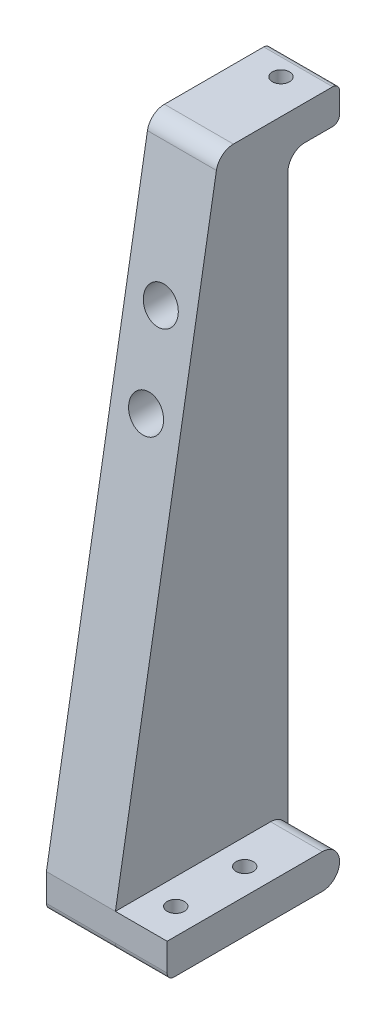
ISO-10303-21;
HEADER;
FILE_DESCRIPTION(('STEP AP214'),'2;1');
FILE_NAME('part.step','',(''),(''),'','','');
FILE_SCHEMA(('AUTOMOTIVE_DESIGN { 1 0 10303 214 1 1 1 1 }'));
ENDSEC;
DATA;
#1=APPLICATION_CONTEXT('core data for automotive mechanical design processes');
#2=APPLICATION_PROTOCOL_DEFINITION('international standard','automotive_design',2000,#1);
#3=PRODUCT_CONTEXT('',#1,'mechanical');
#4=PRODUCT('Part','Part','',(#3));
#5=PRODUCT_RELATED_PRODUCT_CATEGORY('part','',(#4));
#6=PRODUCT_DEFINITION_FORMATION('','',#4);
#7=PRODUCT_DEFINITION_CONTEXT('part definition',#1,'design');
#8=PRODUCT_DEFINITION('design','',#6,#7);
#9=PRODUCT_DEFINITION_SHAPE('','',#8);
#10=(LENGTH_UNIT() NAMED_UNIT(*) SI_UNIT(.MILLI.,.METRE.));
#11=(NAMED_UNIT(*) PLANE_ANGLE_UNIT() SI_UNIT($,.RADIAN.));
#12=(NAMED_UNIT(*) SI_UNIT($,.STERADIAN.) SOLID_ANGLE_UNIT());
#13=UNCERTAINTY_MEASURE_WITH_UNIT(LENGTH_MEASURE(1.E-05),#10,'distance_accuracy_value','');
#14=(GEOMETRIC_REPRESENTATION_CONTEXT(3) GLOBAL_UNCERTAINTY_ASSIGNED_CONTEXT((#13)) GLOBAL_UNIT_ASSIGNED_CONTEXT((#10,
#11,#12)) REPRESENTATION_CONTEXT('',''));
#15=CARTESIAN_POINT('',(0.,0.,0.));
#16=DIRECTION('',(0.,0.,1.));
#17=DIRECTION('',(1.,0.,0.));
#18=AXIS2_PLACEMENT_3D('',#15,#16,#17);
#19=CARTESIAN_POINT('',(25.4,0.,0.));
#20=DIRECTION('',(1.,0.,0.));
#21=DIRECTION('',(0.,0.,-1.));
#22=AXIS2_PLACEMENT_3D('',#19,#20,#21);
#23=PLANE('',#22);
#24=DIRECTION('',(0.,-0.985713472108819,0.168430849024688));
#25=VECTOR('',#24,1.);
#26=CARTESIAN_POINT('',(25.4,5.45142252306016,31.9035417457891));
#27=LINE('',#26,#25);
#28=CARTESIAN_POINT('',(25.4,112.556485891307,13.602283552206));
#29=VERTEX_POINT('',#28);
#30=CARTESIAN_POINT('',(25.4,-105.13695,50.8));
#31=VERTEX_POINT('',#30);
#32=EDGE_CURVE('E204',#29,#31,#27,.T.);
#33=ORIENTED_EDGE('',*,*,#32,.T.);
#34=DIRECTION('',(0.,0.,-1.));
#35=VECTOR('',#34,1.);
#36=CARTESIAN_POINT('',(25.4,-105.13695,-12.7));
#37=LINE('',#36,#35);
#38=CARTESIAN_POINT('',(25.4,-105.13695,-6.34999999999996));
#39=VERTEX_POINT('',#38);
#40=EDGE_CURVE('E165',#31,#39,#37,.T.);
#41=ORIENTED_EDGE('',*,*,#40,.T.);
#42=CARTESIAN_POINT('',(25.4,-111.48695,-6.34999999999996));
#43=DIRECTION('',(1.,0.,0.));
#44=DIRECTION('',(0.,0.,-1.));
#45=AXIS2_PLACEMENT_3D('',#42,#43,#44);
#46=CIRCLE('',#45,6.35);
#47=CARTESIAN_POINT('',(25.4,-111.48695,-12.7));
#48=VERTEX_POINT('',#47);
#49=EDGE_CURVE('E11',#39,#48,#46,.F.);
#50=ORIENTED_EDGE('',*,*,#49,.T.);
#51=DIRECTION('',(0.,1.,0.));
#52=VECTOR('',#51,1.);
#53=CARTESIAN_POINT('',(25.4,0.,-12.7));
#54=LINE('',#53,#52);
#55=CARTESIAN_POINT('',(25.4,98.78695,-12.7));
#56=VERTEX_POINT('',#55);
#57=EDGE_CURVE('E207',#48,#56,#54,.T.);
#58=ORIENTED_EDGE('',*,*,#57,.T.);
#59=CARTESIAN_POINT('',(25.4,98.78695,-19.05));
#60=DIRECTION('',(1.,0.,0.));
#61=DIRECTION('',(0.,0.,-1.));
#62=AXIS2_PLACEMENT_3D('',#59,#60,#61);
#63=CIRCLE('',#62,6.35);
#64=CARTESIAN_POINT('',(25.4,105.13695,-19.05));
#65=VERTEX_POINT('',#64);
#66=EDGE_CURVE('E263',#56,#65,#63,.F.);
#67=ORIENTED_EDGE('',*,*,#66,.T.);
#68=DIRECTION('',(0.,0.,-1.));
#69=VECTOR('',#68,1.);
#70=CARTESIAN_POINT('',(25.4,105.13695,0.));
#71=LINE('',#70,#69);
#72=CARTESIAN_POINT('',(25.4,105.13695,-29.21));
#73=VERTEX_POINT('',#72);
#74=EDGE_CURVE('E209',#65,#73,#71,.T.);
#75=ORIENTED_EDGE('',*,*,#74,.T.);
#76=CARTESIAN_POINT('',(25.4,107.67695,-29.21));
#77=DIRECTION('',(1.,0.,0.));
#78=DIRECTION('',(0.,0.,-1.));
#79=AXIS2_PLACEMENT_3D('',#76,#77,#78);
#80=CIRCLE('',#79,2.54);
#81=CARTESIAN_POINT('',(25.4,107.67695,-31.75));
#82=VERTEX_POINT('',#81);
#83=EDGE_CURVE('E281',#73,#82,#80,.T.);
#84=ORIENTED_EDGE('',*,*,#83,.T.);
#85=DIRECTION('',(0.,-1.,0.));
#86=VECTOR('',#85,1.);
#87=CARTESIAN_POINT('',(25.4,0.,-31.7500000000001));
#88=LINE('',#87,#86);
#89=CARTESIAN_POINT('',(25.4,115.29695,-31.75));
#90=VERTEX_POINT('',#89);
#91=EDGE_CURVE('E212',#90,#82,#88,.T.);
#92=ORIENTED_EDGE('',*,*,#91,.F.);
#93=CARTESIAN_POINT('',(25.4,115.29695,-29.21));
#94=DIRECTION('',(1.,0.,0.));
#95=DIRECTION('',(0.,0.,-1.));
#96=AXIS2_PLACEMENT_3D('',#93,#94,#95);
#97=CIRCLE('',#96,2.54);
#98=CARTESIAN_POINT('',(25.4,117.83695,-29.21));
#99=VERTEX_POINT('',#98);
#100=EDGE_CURVE('E283',#90,#99,#97,.T.);
#101=ORIENTED_EDGE('',*,*,#100,.T.);
#102=DIRECTION('',(0.,0.,-1.));
#103=VECTOR('',#102,1.);
#104=CARTESIAN_POINT('',(25.4,117.83695,0.));
#105=LINE('',#104,#103);
#106=CARTESIAN_POINT('',(25.4,117.83695,7.34300300431497));
#107=VERTEX_POINT('',#106);
#108=EDGE_CURVE('E201',#107,#99,#105,.T.);
#109=ORIENTED_EDGE('',*,*,#108,.F.);
#110=CARTESIAN_POINT('',(25.4,111.48695,7.34300300431497));
#111=DIRECTION('',(1.,0.,0.));
#112=DIRECTION('',(0.,0.,-1.));
#113=AXIS2_PLACEMENT_3D('',#110,#111,#112);
#114=CIRCLE('',#113,6.35);
#115=EDGE_CURVE('E248',#107,#29,#114,.T.);
#116=ORIENTED_EDGE('',*,*,#115,.T.);
#117=EDGE_LOOP('',(#33,#41,#50,#58,#67,#75,#84,#92,#101,#109,#116));
#118=FACE_BOUND('',#117,.T.);
#119=ADVANCED_FACE('F41',(#118),#23,.T.);
#120=CARTESIAN_POINT('',(25.4,117.83695,0.));
#121=DIRECTION('',(0.,1.,0.));
#122=DIRECTION('',(0.,0.,1.));
#123=AXIS2_PLACEMENT_3D('',#120,#121,#122);
#124=PLANE('',#123);
#125=CARTESIAN_POINT('',(12.7,117.83695,-22.86));
#126=DIRECTION('',(0.,1.,0.));
#127=DIRECTION('',(0.,0.,1.));
#128=AXIS2_PLACEMENT_3D('',#125,#126,#127);
#129=CIRCLE('',#128,3.175);
#130=CARTESIAN_POINT('',(12.7,117.83695,-19.685));
#131=VERTEX_POINT('',#130);
#132=EDGE_CURVE('E193',#131,#131,#129,.T.);
#133=ORIENTED_EDGE('',*,*,#132,.F.);
#134=EDGE_LOOP('',(#133));
#135=FACE_BOUND('',#134,.T.);
#136=ORIENTED_EDGE('',*,*,#108,.T.);
#137=DIRECTION('',(-1.,0.,0.));
#138=VECTOR('',#137,1.);
#139=CARTESIAN_POINT('',(25.4,117.83695,-29.21));
#140=LINE('',#139,#138);
#141=CARTESIAN_POINT('',(0.,117.83695,-29.21));
#142=VERTEX_POINT('',#141);
#143=EDGE_CURVE('E265',#99,#142,#140,.T.);
#144=ORIENTED_EDGE('',*,*,#143,.T.);
#145=DIRECTION('',(0.,0.,-1.));
#146=VECTOR('',#145,1.);
#147=CARTESIAN_POINT('',(0.,117.83695,0.));
#148=LINE('',#147,#146);
#149=CARTESIAN_POINT('',(0.,117.83695,7.34300300431497));
#150=VERTEX_POINT('',#149);
#151=EDGE_CURVE('E216',#150,#142,#148,.T.);
#152=ORIENTED_EDGE('',*,*,#151,.F.);
#153=DIRECTION('',(-1.,0.,0.));
#154=VECTOR('',#153,1.);
#155=CARTESIAN_POINT('',(25.4,117.83695,7.34300300431497));
#156=LINE('',#155,#154);
#157=EDGE_CURVE('E243',#150,#107,#156,.F.);
#158=ORIENTED_EDGE('',*,*,#157,.T.);
#159=EDGE_LOOP('',(#136,#144,#152,#158));
#160=FACE_BOUND('',#159,.T.);
#161=ADVANCED_FACE('F370',(#135,#160),#124,.T.);
#162=CARTESIAN_POINT('',(25.4,5.45142252306016,31.9035417457891));
#163=DIRECTION('',(0.,-0.168430849024688,-0.985713472108819));
#164=DIRECTION('',(0.,0.985713472108819,-0.168430849024688));
#165=AXIS2_PLACEMENT_3D('',#162,#163,#164);
#166=PLANE('',#165);
#167=CARTESIAN_POINT('',(12.7,67.03695,21.3802984564561));
#168=DIRECTION('',(0.,-0.168430849024688,-0.985713472108819));
#169=DIRECTION('',(0.,-0.985713472108819,0.168430849024688));
#170=AXIS2_PLACEMENT_3D('',#167,#168,#169);
#171=ELLIPSE('',#170,6.44203430274207,6.35);
#172=CARTESIAN_POINT('',(12.7,60.68695,22.4653357635131));
#173=VERTEX_POINT('',#172);
#174=EDGE_CURVE('E197',#173,#173,#171,.F.);
#175=ORIENTED_EDGE('',*,*,#174,.F.);
#176=EDGE_LOOP('',(#175));
#177=FACE_BOUND('',#176,.T.);
#178=CARTESIAN_POINT('',(12.6999999999999,35.2869500000001,26.8054849917412));
#179=DIRECTION('',(0.,-0.168430849024688,-0.985713472108819));
#180=DIRECTION('',(0.,-0.985713472108819,0.168430849024688));
#181=AXIS2_PLACEMENT_3D('',#178,#179,#180);
#182=ELLIPSE('',#181,6.44203430274207,6.35);
#183=CARTESIAN_POINT('',(12.6999999999999,28.9369500000001,27.8905222987982));
#184=VERTEX_POINT('',#183);
#185=EDGE_CURVE('E300',#184,#184,#182,.F.);
#186=ORIENTED_EDGE('',*,*,#185,.F.);
#187=EDGE_LOOP('',(#186));
#188=FACE_BOUND('',#187,.T.);
#189=ORIENTED_EDGE('',*,*,#32,.F.);
#190=DIRECTION('',(-1.,0.,0.));
#191=VECTOR('',#190,1.);
#192=CARTESIAN_POINT('',(0.,112.556485891307,13.602283552206));
#193=LINE('',#192,#191);
#194=CARTESIAN_POINT('',(0.,112.556485891307,13.602283552206));
#195=VERTEX_POINT('',#194);
#196=EDGE_CURVE('E236',#29,#195,#193,.T.);
#197=ORIENTED_EDGE('',*,*,#196,.T.);
#198=DIRECTION('',(0.,-0.985713472108819,0.168430849024688));
#199=VECTOR('',#198,1.);
#200=CARTESIAN_POINT('',(0.,5.45142252306016,31.9035417457891));
#201=LINE('',#200,#199);
#202=CARTESIAN_POINT('',(0.,-105.13695,50.8));
#203=VERTEX_POINT('',#202);
#204=EDGE_CURVE('E219',#195,#203,#201,.T.);
#205=ORIENTED_EDGE('',*,*,#204,.T.);
#206=DIRECTION('',(-1.,0.,0.));
#207=VECTOR('',#206,1.);
#208=CARTESIAN_POINT('',(25.4,-105.13695,50.8));
#209=LINE('',#208,#207);
#210=EDGE_CURVE('E215',#31,#203,#209,.T.);
#211=ORIENTED_EDGE('',*,*,#210,.F.);
#212=EDGE_LOOP('',(#189,#197,#205,#211));
#213=FACE_BOUND('',#212,.T.);
#214=ADVANCED_FACE('F376',(#177,#188,#213),#166,.F.);
#215=CARTESIAN_POINT('',(25.4,0.,50.8000000000001));
#216=DIRECTION('',(0.,0.,-1.));
#217=DIRECTION('',(0.,1.,0.));
#218=AXIS2_PLACEMENT_3D('',#215,#216,#217);
#219=PLANE('',#218);
#220=DIRECTION('',(-1.,0.,0.));
#221=VECTOR('',#220,1.);
#222=CARTESIAN_POINT('',(25.4,-115.29695,50.8));
#223=LINE('',#222,#221);
#224=CARTESIAN_POINT('',(0.,-115.29695,50.8));
#225=VERTEX_POINT('',#224);
#226=CARTESIAN_POINT('',(25.4,-115.29695,50.8));
#227=VERTEX_POINT('',#226);
#228=EDGE_CURVE('E290',#225,#227,#223,.F.);
#229=ORIENTED_EDGE('',*,*,#228,.T.);
#230=DIRECTION('',(-1.,0.,0.));
#231=VECTOR('',#230,1.);
#232=CARTESIAN_POINT('',(44.45,-115.29695,50.8));
#233=LINE('',#232,#231);
#234=CARTESIAN_POINT('',(44.45,-115.29695,50.8));
#235=VERTEX_POINT('',#234);
#236=EDGE_CURVE('E173',#227,#235,#233,.F.);
#237=ORIENTED_EDGE('',*,*,#236,.T.);
#238=DIRECTION('',(0.,-1.,0.));
#239=VECTOR('',#238,1.);
#240=CARTESIAN_POINT('',(44.45,-105.13695,50.8));
#241=LINE('',#240,#239);
#242=CARTESIAN_POINT('',(44.45,-105.13695,50.8));
#243=VERTEX_POINT('',#242);
#244=EDGE_CURVE('E160',#243,#235,#241,.T.);
#245=ORIENTED_EDGE('',*,*,#244,.F.);
#246=DIRECTION('',(-1.,0.,0.));
#247=VECTOR('',#246,1.);
#248=CARTESIAN_POINT('',(25.4,-105.13695,50.8));
#249=LINE('',#248,#247);
#250=EDGE_CURVE('E164',#243,#31,#249,.T.);
#251=ORIENTED_EDGE('',*,*,#250,.T.);
#252=ORIENTED_EDGE('',*,*,#210,.T.);
#253=DIRECTION('',(0.,-1.,0.));
#254=VECTOR('',#253,1.);
#255=CARTESIAN_POINT('',(0.,0.,50.8000000000001));
#256=LINE('',#255,#254);
#257=EDGE_CURVE('E221',#203,#225,#256,.T.);
#258=ORIENTED_EDGE('',*,*,#257,.T.);
#259=EDGE_LOOP('',(#229,#237,#245,#251,#252,#258));
#260=FACE_BOUND('',#259,.T.);
#261=ADVANCED_FACE('F169',(#260),#219,.F.);
#262=CARTESIAN_POINT('',(25.4,-117.83695,0.));
#263=DIRECTION('',(0.,-1.,0.));
#264=DIRECTION('',(0.,0.,-1.));
#265=AXIS2_PLACEMENT_3D('',#262,#263,#264);
#266=PLANE('',#265);
#267=DIRECTION('',(-1.,0.,0.));
#268=VECTOR('',#267,1.);
#269=CARTESIAN_POINT('',(25.4,-117.83695,-6.34999999999996));
#270=LINE('',#269,#268);
#271=CARTESIAN_POINT('',(0.,-117.83695,-6.34999999999996));
#272=VERTEX_POINT('',#271);
#273=CARTESIAN_POINT('',(25.4,-117.83695,-6.34999999999996));
#274=VERTEX_POINT('',#273);
#275=EDGE_CURVE('E259',#272,#274,#270,.F.);
#276=ORIENTED_EDGE('',*,*,#275,.T.);
#277=DIRECTION('',(1.,0.,0.));
#278=VECTOR('',#277,1.);
#279=CARTESIAN_POINT('',(44.45,-117.83695,-6.34999999999996));
#280=LINE('',#279,#278);
#281=CARTESIAN_POINT('',(44.45,-117.83695,-6.34999999999996));
#282=VERTEX_POINT('',#281);
#283=EDGE_CURVE('E50',#274,#282,#280,.T.);
#284=ORIENTED_EDGE('',*,*,#283,.T.);
#285=DIRECTION('',(0.,0.,1.));
#286=VECTOR('',#285,1.);
#287=CARTESIAN_POINT('',(44.45,-117.83695,-12.7));
#288=LINE('',#287,#286);
#289=CARTESIAN_POINT('',(44.45,-117.83695,48.26));
#290=VERTEX_POINT('',#289);
#291=EDGE_CURVE('E181',#282,#290,#288,.T.);
#292=ORIENTED_EDGE('',*,*,#291,.T.);
#293=DIRECTION('',(-1.,0.,0.));
#294=VECTOR('',#293,1.);
#295=CARTESIAN_POINT('',(25.4,-117.83695,48.26));
#296=LINE('',#295,#294);
#297=CARTESIAN_POINT('',(25.4,-117.83695,48.26));
#298=VERTEX_POINT('',#297);
#299=EDGE_CURVE('E292',#290,#298,#296,.T.);
#300=ORIENTED_EDGE('',*,*,#299,.T.);
#301=DIRECTION('',(-1.,0.,0.));
#302=VECTOR('',#301,1.);
#303=CARTESIAN_POINT('',(0.,-117.83695,48.26));
#304=LINE('',#303,#302);
#305=CARTESIAN_POINT('',(0.,-117.83695,48.26));
#306=VERTEX_POINT('',#305);
#307=EDGE_CURVE('E287',#298,#306,#304,.T.);
#308=ORIENTED_EDGE('',*,*,#307,.T.);
#309=DIRECTION('',(0.,0.,1.));
#310=VECTOR('',#309,1.);
#311=CARTESIAN_POINT('',(0.,-117.83695,0.));
#312=LINE('',#311,#310);
#313=EDGE_CURVE('E224',#272,#306,#312,.T.);
#314=ORIENTED_EDGE('',*,*,#313,.F.);
#315=EDGE_LOOP('',(#276,#284,#292,#300,#308,#314));
#316=FACE_BOUND('',#315,.T.);
#317=CARTESIAN_POINT('',(34.925,-117.83695,12.7));
#318=DIRECTION('',(0.,-1.,0.));
#319=DIRECTION('',(0.,0.,-1.));
#320=AXIS2_PLACEMENT_3D('',#317,#318,#319);
#321=CIRCLE('',#320,3.175);
#322=CARTESIAN_POINT('',(34.925,-117.83695,9.525));
#323=VERTEX_POINT('',#322);
#324=EDGE_CURVE('E327',#323,#323,#321,.T.);
#325=ORIENTED_EDGE('',*,*,#324,.F.);
#326=EDGE_LOOP('',(#325));
#327=FACE_BOUND('',#326,.T.);
#328=CARTESIAN_POINT('',(34.925,-117.83695,38.1));
#329=DIRECTION('',(0.,-1.,0.));
#330=DIRECTION('',(0.,0.,-1.));
#331=AXIS2_PLACEMENT_3D('',#328,#329,#330);
#332=CIRCLE('',#331,3.175);
#333=CARTESIAN_POINT('',(34.925,-117.83695,34.925));
#334=VERTEX_POINT('',#333);
#335=EDGE_CURVE('E334',#334,#334,#332,.T.);
#336=ORIENTED_EDGE('',*,*,#335,.F.);
#337=EDGE_LOOP('',(#336));
#338=FACE_BOUND('',#337,.T.);
#339=ADVANCED_FACE('F318',(#316,#327,#338),#266,.T.);
#340=CARTESIAN_POINT('',(25.4,0.,-12.7));
#341=DIRECTION('',(0.,0.,1.));
#342=DIRECTION('',(0.,-1.,0.));
#343=AXIS2_PLACEMENT_3D('',#340,#341,#342);
#344=PLANE('',#343);
#345=CARTESIAN_POINT('',(12.7,35.28695,-12.7));
#346=DIRECTION('',(0.,0.,-1.));
#347=DIRECTION('',(-1.,0.,0.));
#348=AXIS2_PLACEMENT_3D('',#345,#346,#347);
#349=CIRCLE('',#348,3.225000027);
#350=CARTESIAN_POINT('',(9.47499997299999,35.28695,-12.7));
#351=VERTEX_POINT('',#350);
#352=EDGE_CURVE('E190',#351,#351,#349,.T.);
#353=ORIENTED_EDGE('',*,*,#352,.F.);
#354=EDGE_LOOP('',(#353));
#355=FACE_BOUND('',#354,.T.);
#356=CARTESIAN_POINT('',(12.7,67.03695,-12.7));
#357=DIRECTION('',(0.,0.,-1.));
#358=DIRECTION('',(-1.,0.,0.));
#359=AXIS2_PLACEMENT_3D('',#356,#357,#358);
#360=CIRCLE('',#359,3.18000000269999);
#361=CARTESIAN_POINT('',(9.5199999973,67.03695,-12.7));
#362=VERTEX_POINT('',#361);
#363=EDGE_CURVE('E194',#362,#362,#360,.T.);
#364=ORIENTED_EDGE('',*,*,#363,.F.);
#365=EDGE_LOOP('',(#364));
#366=FACE_BOUND('',#365,.T.);
#367=ORIENTED_EDGE('',*,*,#57,.F.);
#368=DIRECTION('',(-1.,0.,0.));
#369=VECTOR('',#368,1.);
#370=CARTESIAN_POINT('',(0.,-111.48695,-12.7));
#371=LINE('',#370,#369);
#372=CARTESIAN_POINT('',(0.,-111.48695,-12.7));
#373=VERTEX_POINT('',#372);
#374=EDGE_CURVE('E253',#48,#373,#371,.T.);
#375=ORIENTED_EDGE('',*,*,#374,.T.);
#376=DIRECTION('',(0.,1.,0.));
#377=VECTOR('',#376,1.);
#378=CARTESIAN_POINT('',(0.,0.,-12.7));
#379=LINE('',#378,#377);
#380=CARTESIAN_POINT('',(0.,98.78695,-12.7));
#381=VERTEX_POINT('',#380);
#382=EDGE_CURVE('E227',#373,#381,#379,.T.);
#383=ORIENTED_EDGE('',*,*,#382,.T.);
#384=DIRECTION('',(-1.,0.,0.));
#385=VECTOR('',#384,1.);
#386=CARTESIAN_POINT('',(25.4,98.78695,-12.7));
#387=LINE('',#386,#385);
#388=EDGE_CURVE('E256',#381,#56,#387,.F.);
#389=ORIENTED_EDGE('',*,*,#388,.T.);
#390=EDGE_LOOP('',(#367,#375,#383,#389));
#391=FACE_BOUND('',#390,.T.);
#392=ADVANCED_FACE('F356',(#355,#366,#391),#344,.F.);
#393=CARTESIAN_POINT('',(25.4,105.13695,0.));
#394=DIRECTION('',(0.,1.,0.));
#395=DIRECTION('',(0.,0.,1.));
#396=AXIS2_PLACEMENT_3D('',#393,#394,#395);
#397=PLANE('',#396);
#398=CARTESIAN_POINT('',(12.7,105.13695,-22.86));
#399=DIRECTION('',(0.,1.,0.));
#400=DIRECTION('',(0.,0.,1.));
#401=AXIS2_PLACEMENT_3D('',#398,#399,#400);
#402=CIRCLE('',#401,3.175);
#403=CARTESIAN_POINT('',(12.7,105.13695,-19.685));
#404=VERTEX_POINT('',#403);
#405=EDGE_CURVE('E200',#404,#404,#402,.T.);
#406=ORIENTED_EDGE('',*,*,#405,.T.);
#407=EDGE_LOOP('',(#406));
#408=FACE_BOUND('',#407,.T.);
#409=DIRECTION('',(0.,0.,-1.));
#410=VECTOR('',#409,1.);
#411=CARTESIAN_POINT('',(0.,105.13695,0.));
#412=LINE('',#411,#410);
#413=CARTESIAN_POINT('',(0.,105.13695,-19.05));
#414=VERTEX_POINT('',#413);
#415=CARTESIAN_POINT('',(0.,105.13695,-29.21));
#416=VERTEX_POINT('',#415);
#417=EDGE_CURVE('E230',#414,#416,#412,.T.);
#418=ORIENTED_EDGE('',*,*,#417,.T.);
#419=DIRECTION('',(-1.,0.,0.));
#420=VECTOR('',#419,1.);
#421=CARTESIAN_POINT('',(25.4,105.13695,-29.21));
#422=LINE('',#421,#420);
#423=EDGE_CURVE('E285',#416,#73,#422,.F.);
#424=ORIENTED_EDGE('',*,*,#423,.T.);
#425=ORIENTED_EDGE('',*,*,#74,.F.);
#426=DIRECTION('',(-1.,0.,0.));
#427=VECTOR('',#426,1.);
#428=CARTESIAN_POINT('',(0.,105.13695,-19.05));
#429=LINE('',#428,#427);
#430=EDGE_CURVE('E250',#65,#414,#429,.T.);
#431=ORIENTED_EDGE('',*,*,#430,.T.);
#432=EDGE_LOOP('',(#418,#424,#425,#431));
#433=FACE_BOUND('',#432,.T.);
#434=ADVANCED_FACE('F391',(#408,#433),#397,.F.);
#435=CARTESIAN_POINT('',(25.4,0.,-31.7500000000001));
#436=DIRECTION('',(0.,0.,-1.));
#437=DIRECTION('',(0.,1.,0.));
#438=AXIS2_PLACEMENT_3D('',#435,#436,#437);
#439=PLANE('',#438);
#440=DIRECTION('',(0.,-1.,0.));
#441=VECTOR('',#440,1.);
#442=CARTESIAN_POINT('',(0.,0.,-31.7500000000001));
#443=LINE('',#442,#441);
#444=CARTESIAN_POINT('',(0.,115.29695,-31.75));
#445=VERTEX_POINT('',#444);
#446=CARTESIAN_POINT('',(0.,107.67695,-31.75));
#447=VERTEX_POINT('',#446);
#448=EDGE_CURVE('E205',#445,#447,#443,.T.);
#449=ORIENTED_EDGE('',*,*,#448,.F.);
#450=DIRECTION('',(-1.,0.,0.));
#451=VECTOR('',#450,1.);
#452=CARTESIAN_POINT('',(25.4,115.29695,-31.75));
#453=LINE('',#452,#451);
#454=EDGE_CURVE('E277',#445,#90,#453,.F.);
#455=ORIENTED_EDGE('',*,*,#454,.T.);
#456=ORIENTED_EDGE('',*,*,#91,.T.);
#457=DIRECTION('',(-1.,0.,0.));
#458=VECTOR('',#457,1.);
#459=CARTESIAN_POINT('',(0.,107.67695,-31.75));
#460=LINE('',#459,#458);
#461=EDGE_CURVE('E274',#82,#447,#460,.T.);
#462=ORIENTED_EDGE('',*,*,#461,.T.);
#463=EDGE_LOOP('',(#449,#455,#456,#462));
#464=FACE_BOUND('',#463,.T.);
#465=ADVANCED_FACE('F387',(#464),#439,.T.);
#466=CARTESIAN_POINT('',(0.,0.,0.));
#467=DIRECTION('',(1.,0.,0.));
#468=DIRECTION('',(0.,0.,-1.));
#469=AXIS2_PLACEMENT_3D('',#466,#467,#468);
#470=PLANE('',#469);
#471=ORIENTED_EDGE('',*,*,#151,.T.);
#472=CARTESIAN_POINT('',(0.,115.29695,-29.21));
#473=DIRECTION('',(1.,0.,0.));
#474=DIRECTION('',(0.,0.,-1.));
#475=AXIS2_PLACEMENT_3D('',#472,#473,#474);
#476=CIRCLE('',#475,2.54);
#477=EDGE_CURVE('E272',#142,#445,#476,.F.);
#478=ORIENTED_EDGE('',*,*,#477,.T.);
#479=ORIENTED_EDGE('',*,*,#448,.T.);
#480=CARTESIAN_POINT('',(0.,107.67695,-29.21));
#481=DIRECTION('',(1.,0.,0.));
#482=DIRECTION('',(0.,0.,-1.));
#483=AXIS2_PLACEMENT_3D('',#480,#481,#482);
#484=CIRCLE('',#483,2.54);
#485=EDGE_CURVE('E270',#447,#416,#484,.F.);
#486=ORIENTED_EDGE('',*,*,#485,.T.);
#487=ORIENTED_EDGE('',*,*,#417,.F.);
#488=CARTESIAN_POINT('',(0.,98.78695,-19.05));
#489=DIRECTION('',(1.,0.,0.));
#490=DIRECTION('',(0.,0.,-1.));
#491=AXIS2_PLACEMENT_3D('',#488,#489,#490);
#492=CIRCLE('',#491,6.35);
#493=EDGE_CURVE('E261',#414,#381,#492,.T.);
#494=ORIENTED_EDGE('',*,*,#493,.T.);
#495=ORIENTED_EDGE('',*,*,#382,.F.);
#496=CARTESIAN_POINT('',(0.,-111.48695,-6.34999999999996));
#497=DIRECTION('',(1.,0.,0.));
#498=DIRECTION('',(0.,0.,-1.));
#499=AXIS2_PLACEMENT_3D('',#496,#497,#498);
#500=CIRCLE('',#499,6.35);
#501=EDGE_CURVE('E239',#373,#272,#500,.F.);
#502=ORIENTED_EDGE('',*,*,#501,.T.);
#503=ORIENTED_EDGE('',*,*,#313,.T.);
#504=CARTESIAN_POINT('',(0.,-115.29695,48.26));
#505=DIRECTION('',(1.,0.,0.));
#506=DIRECTION('',(0.,0.,-1.));
#507=AXIS2_PLACEMENT_3D('',#504,#505,#506);
#508=CIRCLE('',#507,2.54);
#509=EDGE_CURVE('E268',#306,#225,#508,.F.);
#510=ORIENTED_EDGE('',*,*,#509,.T.);
#511=ORIENTED_EDGE('',*,*,#257,.F.);
#512=ORIENTED_EDGE('',*,*,#204,.F.);
#513=CARTESIAN_POINT('',(0.,111.48695,7.34300300431497));
#514=DIRECTION('',(1.,0.,0.));
#515=DIRECTION('',(0.,0.,-1.));
#516=AXIS2_PLACEMENT_3D('',#513,#514,#515);
#517=CIRCLE('',#516,6.35);
#518=EDGE_CURVE('E241',#195,#150,#517,.F.);
#519=ORIENTED_EDGE('',*,*,#518,.T.);
#520=EDGE_LOOP('',(#471,#478,#479,#486,#487,#494,#495,#502,#503,#510,#511,#512,#519));
#521=FACE_BOUND('',#520,.T.);
#522=ADVANCED_FACE('F383',(#521),#470,.F.);
#523=CARTESIAN_POINT('',(25.4,111.48695,7.34300300431497));
#524=DIRECTION('',(1.,0.,0.));
#525=DIRECTION('',(0.,0.,-1.));
#526=AXIS2_PLACEMENT_3D('',#523,#524,#525);
#527=CYLINDRICAL_SURFACE('',#526,6.35);
#528=ORIENTED_EDGE('',*,*,#115,.F.);
#529=ORIENTED_EDGE('',*,*,#157,.F.);
#530=ORIENTED_EDGE('',*,*,#518,.F.);
#531=ORIENTED_EDGE('',*,*,#196,.F.);
#532=EDGE_LOOP('',(#528,#529,#530,#531));
#533=FACE_BOUND('',#532,.T.);
#534=ADVANCED_FACE('F386',(#533),#527,.T.);
#535=CARTESIAN_POINT('',(25.4,98.78695,-19.05));
#536=DIRECTION('',(1.,0.,0.));
#537=DIRECTION('',(0.,0.,-1.));
#538=AXIS2_PLACEMENT_3D('',#535,#536,#537);
#539=CYLINDRICAL_SURFACE('',#538,6.35);
#540=ORIENTED_EDGE('',*,*,#66,.F.);
#541=ORIENTED_EDGE('',*,*,#388,.F.);
#542=ORIENTED_EDGE('',*,*,#493,.F.);
#543=ORIENTED_EDGE('',*,*,#430,.F.);
#544=EDGE_LOOP('',(#540,#541,#542,#543));
#545=FACE_BOUND('',#544,.T.);
#546=ADVANCED_FACE('F405',(#545),#539,.F.);
#547=CARTESIAN_POINT('',(25.4,-111.48695,-6.34999999999996));
#548=DIRECTION('',(1.,0.,0.));
#549=DIRECTION('',(0.,0.,-1.));
#550=AXIS2_PLACEMENT_3D('',#547,#548,#549);
#551=CYLINDRICAL_SURFACE('',#550,6.35);
#552=CARTESIAN_POINT('',(25.4,-111.48695,-6.34999999999996));
#553=DIRECTION('',(1.,0.,0.));
#554=DIRECTION('',(0.,0.,-1.));
#555=AXIS2_PLACEMENT_3D('',#552,#553,#554);
#556=CIRCLE('',#555,6.35);
#557=EDGE_CURVE('E245',#274,#48,#556,.T.);
#558=ORIENTED_EDGE('',*,*,#557,.F.);
#559=ORIENTED_EDGE('',*,*,#275,.F.);
#560=ORIENTED_EDGE('',*,*,#501,.F.);
#561=ORIENTED_EDGE('',*,*,#374,.F.);
#562=EDGE_LOOP('',(#558,#559,#560,#561));
#563=FACE_BOUND('',#562,.T.);
#564=ADVANCED_FACE('F409',(#563),#551,.T.);
#565=CARTESIAN_POINT('',(25.4,115.29695,-29.21));
#566=DIRECTION('',(-1.,0.,0.));
#567=DIRECTION('',(0.,0.,1.));
#568=AXIS2_PLACEMENT_3D('',#565,#566,#567);
#569=CYLINDRICAL_SURFACE('',#568,2.54);
#570=ORIENTED_EDGE('',*,*,#100,.F.);
#571=ORIENTED_EDGE('',*,*,#454,.F.);
#572=ORIENTED_EDGE('',*,*,#477,.F.);
#573=ORIENTED_EDGE('',*,*,#143,.F.);
#574=EDGE_LOOP('',(#570,#571,#572,#573));
#575=FACE_BOUND('',#574,.T.);
#576=ADVANCED_FACE('F413',(#575),#569,.T.);
#577=CARTESIAN_POINT('',(25.4,107.67695,-29.21));
#578=DIRECTION('',(1.,0.,0.));
#579=DIRECTION('',(0.,0.,-1.));
#580=AXIS2_PLACEMENT_3D('',#577,#578,#579);
#581=CYLINDRICAL_SURFACE('',#580,2.54);
#582=ORIENTED_EDGE('',*,*,#83,.F.);
#583=ORIENTED_EDGE('',*,*,#423,.F.);
#584=ORIENTED_EDGE('',*,*,#485,.F.);
#585=ORIENTED_EDGE('',*,*,#461,.F.);
#586=EDGE_LOOP('',(#582,#583,#584,#585));
#587=FACE_BOUND('',#586,.T.);
#588=ADVANCED_FACE('F417',(#587),#581,.T.);
#589=CARTESIAN_POINT('',(25.4,-115.29695,48.26));
#590=DIRECTION('',(1.,0.,0.));
#591=DIRECTION('',(0.,0.,-1.));
#592=AXIS2_PLACEMENT_3D('',#589,#590,#591);
#593=CYLINDRICAL_SURFACE('',#592,2.54);
#594=CARTESIAN_POINT('',(25.4,-115.29695,48.26));
#595=DIRECTION('',(1.,0.,0.));
#596=DIRECTION('',(0.,0.,-1.));
#597=AXIS2_PLACEMENT_3D('',#594,#595,#596);
#598=CIRCLE('',#597,2.54);
#599=EDGE_CURVE('E279',#227,#298,#598,.T.);
#600=ORIENTED_EDGE('',*,*,#599,.F.);
#601=ORIENTED_EDGE('',*,*,#228,.F.);
#602=ORIENTED_EDGE('',*,*,#509,.F.);
#603=ORIENTED_EDGE('',*,*,#307,.F.);
#604=EDGE_LOOP('',(#600,#601,#602,#603));
#605=FACE_BOUND('',#604,.T.);
#606=ADVANCED_FACE('F421',(#605),#593,.T.);
#607=CARTESIAN_POINT('',(12.7,-117.83695,-22.8600000000001));
#608=DIRECTION('',(0.,1.,0.));
#609=DIRECTION('',(0.,0.,1.));
#610=AXIS2_PLACEMENT_3D('',#607,#608,#609);
#611=CYLINDRICAL_SURFACE('',#610,3.175);
#612=CARTESIAN_POINT('',(12.7,117.83695,-19.685));
#613=CARTESIAN_POINT('',(12.7,117.704658333333,-19.685));
#614=CARTESIAN_POINT('',(12.7,117.572366666667,-19.685));
#615=CARTESIAN_POINT('',(12.7,117.307783333333,-19.685));
#616=CARTESIAN_POINT('',(12.7,117.175491666667,-19.685));
#617=CARTESIAN_POINT('',(12.7,116.910908333333,-19.685));
#618=CARTESIAN_POINT('',(12.7,116.778616666667,-19.685));
#619=CARTESIAN_POINT('',(12.7,116.514033333333,-19.685));
#620=CARTESIAN_POINT('',(12.7,116.381741666667,-19.685));
#621=CARTESIAN_POINT('',(12.7,116.117158333333,-19.685));
#622=CARTESIAN_POINT('',(12.7,115.984866666667,-19.685));
#623=CARTESIAN_POINT('',(12.7,115.720283333333,-19.685));
#624=CARTESIAN_POINT('',(12.7,115.587991666667,-19.685));
#625=CARTESIAN_POINT('',(12.7,115.323408333333,-19.685));
#626=CARTESIAN_POINT('',(12.7,115.191116666667,-19.685));
#627=CARTESIAN_POINT('',(12.7,114.926533333333,-19.685));
#628=CARTESIAN_POINT('',(12.7,114.794241666667,-19.685));
#629=CARTESIAN_POINT('',(12.7,114.529658333333,-19.685));
#630=CARTESIAN_POINT('',(12.7,114.397366666667,-19.685));
#631=CARTESIAN_POINT('',(12.7,114.132783333333,-19.685));
#632=CARTESIAN_POINT('',(12.7,114.000491666667,-19.685));
#633=CARTESIAN_POINT('',(12.7,113.735908333333,-19.685));
#634=CARTESIAN_POINT('',(12.7,113.603616666667,-19.685));
#635=CARTESIAN_POINT('',(12.7,113.339033333333,-19.685));
#636=CARTESIAN_POINT('',(12.7,113.206741666667,-19.685));
#637=CARTESIAN_POINT('',(12.7,112.942158333333,-19.685));
#638=CARTESIAN_POINT('',(12.7,112.809866666667,-19.685));
#639=CARTESIAN_POINT('',(12.7,112.545283333333,-19.685));
#640=CARTESIAN_POINT('',(12.7,112.412991666667,-19.685));
#641=CARTESIAN_POINT('',(12.7,112.148408333333,-19.685));
#642=CARTESIAN_POINT('',(12.7,112.016116666667,-19.685));
#643=CARTESIAN_POINT('',(12.7,111.751533333333,-19.685));
#644=CARTESIAN_POINT('',(12.7,111.619241666667,-19.685));
#645=CARTESIAN_POINT('',(12.7,111.354658333333,-19.685));
#646=CARTESIAN_POINT('',(12.7,111.222366666667,-19.685));
#647=CARTESIAN_POINT('',(12.7,110.957783333333,-19.685));
#648=CARTESIAN_POINT('',(12.7,110.825491666667,-19.685));
#649=CARTESIAN_POINT('',(12.7,110.560908333333,-19.685));
#650=CARTESIAN_POINT('',(12.7,110.428616666667,-19.685));
#651=CARTESIAN_POINT('',(12.7,110.164033333333,-19.685));
#652=CARTESIAN_POINT('',(12.7,110.031741666667,-19.685));
#653=CARTESIAN_POINT('',(12.7,109.767158333333,-19.685));
#654=CARTESIAN_POINT('',(12.7,109.634866666667,-19.685));
#655=CARTESIAN_POINT('',(12.7,109.370283333333,-19.685));
#656=CARTESIAN_POINT('',(12.7,109.237991666667,-19.685));
#657=CARTESIAN_POINT('',(12.7,108.973408333333,-19.685));
#658=CARTESIAN_POINT('',(12.7,108.841116666667,-19.685));
#659=CARTESIAN_POINT('',(12.7,108.576533333333,-19.685));
#660=CARTESIAN_POINT('',(12.7,108.444241666667,-19.685));
#661=CARTESIAN_POINT('',(12.7,108.179658333333,-19.685));
#662=CARTESIAN_POINT('',(12.7,108.047366666667,-19.685));
#663=CARTESIAN_POINT('',(12.7,107.782783333333,-19.685));
#664=CARTESIAN_POINT('',(12.7,107.650491666667,-19.685));
#665=CARTESIAN_POINT('',(12.7,107.385908333333,-19.685));
#666=CARTESIAN_POINT('',(12.7,107.253616666667,-19.685));
#667=CARTESIAN_POINT('',(12.7,106.989033333333,-19.685));
#668=CARTESIAN_POINT('',(12.7,106.856741666667,-19.685));
#669=CARTESIAN_POINT('',(12.7,106.592158333333,-19.685));
#670=CARTESIAN_POINT('',(12.7,106.459866666667,-19.685));
#671=CARTESIAN_POINT('',(12.7,106.195283333333,-19.685));
#672=CARTESIAN_POINT('',(12.7,106.062991666667,-19.685));
#673=CARTESIAN_POINT('',(12.7,105.798408333333,-19.685));
#674=CARTESIAN_POINT('',(12.7,105.666116666667,-19.685));
#675=CARTESIAN_POINT('',(12.7,105.401533333333,-19.685));
#676=CARTESIAN_POINT('',(12.7,105.269241666667,-19.685));
#677=CARTESIAN_POINT('',(12.7,105.13695,-19.685));
#678=B_SPLINE_CURVE_WITH_KNOTS('',3,(#612,#613,#614,#615,#616,#617,#618,#619,#620,#621,#622,
#623,#624,#625,#626,#627,#628,#629,#630,#631,#632,#633,#634,#635,#636,#637,#638,#639,#640,#641,
#642,#643,#644,#645,#646,#647,#648,#649,#650,#651,#652,#653,#654,#655,#656,#657,#658,#659,#660,
#661,#662,#663,#664,#665,#666,#667,#668,#669,#670,#671,#672,#673,#674,#675,#676,#677),
.UNSPECIFIED.,.F.,.F.,(4,2,2,2,2,2,2,2,2,2,2,2,2,2,2,2,2,2,2,2,2,2,2,2,2,2,2,2,2,2,2,2,4),(0.,
0.396874999999991,0.79375000000001,1.190625,1.58749999999999,1.98437500000001,2.38125,
2.77812499999999,3.17499999999998,3.571875,3.96874999999999,4.36562499999998,4.7625,
5.15937499999999,5.55624999999998,5.953125,6.34999999999999,6.74687499999999,7.14375,7.540625,
7.93749999999999,8.334375,8.73125,9.12812499999999,9.52500000000001,9.921875,10.31875,10.715625,
11.1125,11.509375,11.90625,12.303125,12.7),.UNSPECIFIED.);
#679=EDGE_CURVE('BSEAM381',#131,#404,#678,.T.);
#680=ORIENTED_EDGE('',*,*,#132,.T.);
#681=ORIENTED_EDGE('',*,*,#405,.F.);
#682=ORIENTED_EDGE('',*,*,#679,.T.);
#683=ORIENTED_EDGE('',*,*,#679,.F.);
#684=EDGE_LOOP('',(#680,#682,#681,#683));
#685=FACE_BOUND('',#684,.T.);
#686=ADVANCED_FACE('F381',(#685),#611,.F.);
#687=CARTESIAN_POINT('',(12.7,67.03695,50.8));
#688=DIRECTION('',(0.,0.,-1.));
#689=DIRECTION('',(-1.,0.,0.));
#690=AXIS2_PLACEMENT_3D('',#687,#688,#689);
#691=CYLINDRICAL_SURFACE('',#690,3.18000000269999);
#692=CARTESIAN_POINT('',(12.7,67.03695,0.));
#693=DIRECTION('',(0.,0.,-1.));
#694=DIRECTION('',(-1.,0.,0.));
#695=AXIS2_PLACEMENT_3D('',#692,#693,#694);
#696=CIRCLE('',#695,3.18000000269999);
#697=CARTESIAN_POINT('',(9.5199999973,67.03695,0.));
#698=VERTEX_POINT('',#697);
#699=EDGE_CURVE('E297',#698,#698,#696,.F.);
#700=ORIENTED_EDGE('',*,*,#699,.T.);
#701=EDGE_LOOP('',(#700));
#702=FACE_BOUND('',#701,.T.);
#703=ORIENTED_EDGE('',*,*,#363,.T.);
#704=EDGE_LOOP('',(#703));
#705=FACE_BOUND('',#704,.T.);
#706=ADVANCED_FACE('F529',(#702,#705),#691,.F.);
#707=CARTESIAN_POINT('',(12.7,35.28695,50.8));
#708=DIRECTION('',(0.,0.,-1.));
#709=DIRECTION('',(-1.,0.,0.));
#710=AXIS2_PLACEMENT_3D('',#707,#708,#709);
#711=CYLINDRICAL_SURFACE('',#710,3.225000027);
#712=CARTESIAN_POINT('',(12.7,35.28695,0.));
#713=DIRECTION('',(0.,0.,-1.));
#714=DIRECTION('',(-1.,0.,0.));
#715=AXIS2_PLACEMENT_3D('',#712,#713,#714);
#716=CIRCLE('',#715,3.225000027);
#717=CARTESIAN_POINT('',(9.47499997299999,35.28695,0.));
#718=VERTEX_POINT('',#717);
#719=EDGE_CURVE('E187',#718,#718,#716,.F.);
#720=ORIENTED_EDGE('',*,*,#719,.T.);
#721=EDGE_LOOP('',(#720));
#722=FACE_BOUND('',#721,.T.);
#723=ORIENTED_EDGE('',*,*,#352,.T.);
#724=EDGE_LOOP('',(#723));
#725=FACE_BOUND('',#724,.T.);
#726=ADVANCED_FACE('F538',(#722,#725),#711,.F.);
#727=CARTESIAN_POINT('',(12.6999999999999,35.2869500000001,0.));
#728=DIRECTION('',(0.,0.,1.));
#729=DIRECTION('',(0.,-1.,0.));
#730=AXIS2_PLACEMENT_3D('',#727,#728,#729);
#731=CYLINDRICAL_SURFACE('',#730,6.35);
#732=CARTESIAN_POINT('',(12.6999999999999,35.2869500000001,0.));
#733=DIRECTION('',(0.,0.,-1.));
#734=DIRECTION('',(-1.,0.,0.));
#735=AXIS2_PLACEMENT_3D('',#732,#733,#734);
#736=CIRCLE('',#735,6.35);
#737=CARTESIAN_POINT('',(6.34999999999988,35.2869500000001,0.));
#738=VERTEX_POINT('',#737);
#739=EDGE_CURVE('E174',#738,#738,#736,.T.);
#740=ORIENTED_EDGE('',*,*,#739,.T.);
#741=EDGE_LOOP('',(#740));
#742=FACE_BOUND('',#741,.T.);
#743=ORIENTED_EDGE('',*,*,#185,.T.);
#744=EDGE_LOOP('',(#743));
#745=FACE_BOUND('',#744,.T.);
#746=ADVANCED_FACE('F547',(#742,#745),#731,.F.);
#747=CARTESIAN_POINT('',(0.,0.,0.));
#748=DIRECTION('',(0.,0.,-1.));
#749=DIRECTION('',(-1.,0.,0.));
#750=AXIS2_PLACEMENT_3D('',#747,#748,#749);
#751=PLANE('',#750);
#752=ORIENTED_EDGE('',*,*,#739,.F.);
#753=EDGE_LOOP('',(#752));
#754=FACE_BOUND('',#753,.T.);
#755=ORIENTED_EDGE('',*,*,#719,.F.);
#756=EDGE_LOOP('',(#755));
#757=FACE_BOUND('',#756,.T.);
#758=ADVANCED_FACE('F557',(#754,#757),#751,.F.);
#759=CARTESIAN_POINT('',(12.7,67.03695,0.));
#760=DIRECTION('',(0.,0.,1.));
#761=DIRECTION('',(0.,-1.,0.));
#762=AXIS2_PLACEMENT_3D('',#759,#760,#761);
#763=CYLINDRICAL_SURFACE('',#762,6.35);
#764=CARTESIAN_POINT('',(12.7,67.03695,0.));
#765=DIRECTION('',(0.,0.,-1.));
#766=DIRECTION('',(-1.,0.,0.));
#767=AXIS2_PLACEMENT_3D('',#764,#765,#766);
#768=CIRCLE('',#767,6.35);
#769=CARTESIAN_POINT('',(6.35,67.03695,0.));
#770=VERTEX_POINT('',#769);
#771=EDGE_CURVE('E184',#770,#770,#768,.T.);
#772=ORIENTED_EDGE('',*,*,#771,.T.);
#773=EDGE_LOOP('',(#772));
#774=FACE_BOUND('',#773,.T.);
#775=ORIENTED_EDGE('',*,*,#174,.T.);
#776=EDGE_LOOP('',(#775));
#777=FACE_BOUND('',#776,.T.);
#778=ADVANCED_FACE('F567',(#774,#777),#763,.F.);
#779=CARTESIAN_POINT('',(0.,0.,0.));
#780=DIRECTION('',(0.,0.,-1.));
#781=DIRECTION('',(-1.,0.,0.));
#782=AXIS2_PLACEMENT_3D('',#779,#780,#781);
#783=PLANE('',#782);
#784=ORIENTED_EDGE('',*,*,#771,.F.);
#785=EDGE_LOOP('',(#784));
#786=FACE_BOUND('',#785,.T.);
#787=ORIENTED_EDGE('',*,*,#699,.F.);
#788=EDGE_LOOP('',(#787));
#789=FACE_BOUND('',#788,.T.);
#790=ADVANCED_FACE('F445',(#786,#789),#783,.F.);
#791=CARTESIAN_POINT('',(44.45,-105.13695,-12.7));
#792=DIRECTION('',(1.,0.,0.));
#793=DIRECTION('',(0.,0.,-1.));
#794=AXIS2_PLACEMENT_3D('',#791,#792,#793);
#795=PLANE('',#794);
#796=CARTESIAN_POINT('',(44.45,-111.48695,-6.34999999999996));
#797=DIRECTION('',(1.,0.,0.));
#798=DIRECTION('',(0.,0.,-1.));
#799=AXIS2_PLACEMENT_3D('',#796,#797,#798);
#800=CIRCLE('',#799,6.35);
#801=CARTESIAN_POINT('',(44.45,-111.48695,-12.7));
#802=VERTEX_POINT('',#801);
#803=EDGE_CURVE('E310',#282,#802,#800,.T.);
#804=ORIENTED_EDGE('',*,*,#803,.T.);
#805=CARTESIAN_POINT('',(44.45,-111.48695,-6.34999999999996));
#806=DIRECTION('',(1.,0.,0.));
#807=DIRECTION('',(0.,0.,-1.));
#808=AXIS2_PLACEMENT_3D('',#805,#806,#807);
#809=CIRCLE('',#808,6.35);
#810=CARTESIAN_POINT('',(44.45,-105.13695,-6.34999999999996));
#811=VERTEX_POINT('',#810);
#812=EDGE_CURVE('E63',#802,#811,#809,.T.);
#813=ORIENTED_EDGE('',*,*,#812,.T.);
#814=DIRECTION('',(0.,0.,1.));
#815=VECTOR('',#814,1.);
#816=CARTESIAN_POINT('',(44.45,-105.13695,-12.7));
#817=LINE('',#816,#815);
#818=EDGE_CURVE('E156',#811,#243,#817,.T.);
#819=ORIENTED_EDGE('',*,*,#818,.T.);
#820=ORIENTED_EDGE('',*,*,#244,.T.);
#821=CARTESIAN_POINT('',(44.45,-115.29695,48.26));
#822=DIRECTION('',(1.,0.,0.));
#823=DIRECTION('',(0.,0.,-1.));
#824=AXIS2_PLACEMENT_3D('',#821,#822,#823);
#825=CIRCLE('',#824,2.54);
#826=EDGE_CURVE('E308',#235,#290,#825,.T.);
#827=ORIENTED_EDGE('',*,*,#826,.T.);
#828=ORIENTED_EDGE('',*,*,#291,.F.);
#829=EDGE_LOOP('',(#804,#813,#819,#820,#827,#828));
#830=FACE_BOUND('',#829,.T.);
#831=ADVANCED_FACE('F158',(#830),#795,.T.);
#832=CARTESIAN_POINT('',(0.,-105.13695,0.));
#833=DIRECTION('',(0.,1.,0.));
#834=DIRECTION('',(0.,0.,1.));
#835=AXIS2_PLACEMENT_3D('',#832,#833,#834);
#836=PLANE('',#835);
#837=CARTESIAN_POINT('',(34.925,-105.13695,12.7));
#838=DIRECTION('',(0.,-1.,0.));
#839=DIRECTION('',(0.,0.,-1.));
#840=AXIS2_PLACEMENT_3D('',#837,#838,#839);
#841=CIRCLE('',#840,3.175);
#842=CARTESIAN_POINT('',(34.925,-105.13695,9.525));
#843=VERTEX_POINT('',#842);
#844=EDGE_CURVE('E337',#843,#843,#841,.T.);
#845=ORIENTED_EDGE('',*,*,#844,.T.);
#846=EDGE_LOOP('',(#845));
#847=FACE_BOUND('',#846,.T.);
#848=CARTESIAN_POINT('',(34.925,-105.13695,38.1));
#849=DIRECTION('',(0.,-1.,0.));
#850=DIRECTION('',(0.,0.,-1.));
#851=AXIS2_PLACEMENT_3D('',#848,#849,#850);
#852=CIRCLE('',#851,3.175);
#853=CARTESIAN_POINT('',(34.925,-105.13695,34.925));
#854=VERTEX_POINT('',#853);
#855=EDGE_CURVE('E182',#854,#854,#852,.T.);
#856=ORIENTED_EDGE('',*,*,#855,.T.);
#857=EDGE_LOOP('',(#856));
#858=FACE_BOUND('',#857,.T.);
#859=ORIENTED_EDGE('',*,*,#818,.F.);
#860=DIRECTION('',(1.,0.,0.));
#861=VECTOR('',#860,1.);
#862=CARTESIAN_POINT('',(25.4,-105.13695,-6.34999999999996));
#863=LINE('',#862,#861);
#864=EDGE_CURVE('E313',#811,#39,#863,.F.);
#865=ORIENTED_EDGE('',*,*,#864,.T.);
#866=ORIENTED_EDGE('',*,*,#40,.F.);
#867=ORIENTED_EDGE('',*,*,#250,.F.);
#868=EDGE_LOOP('',(#859,#865,#866,#867));
#869=FACE_BOUND('',#868,.T.);
#870=ADVANCED_FACE('F176',(#847,#858,#869),#836,.T.);
#871=CARTESIAN_POINT('',(34.925,-105.13695,38.1));
#872=DIRECTION('',(0.,-1.,0.));
#873=DIRECTION('',(0.,0.,-1.));
#874=AXIS2_PLACEMENT_3D('',#871,#872,#873);
#875=CYLINDRICAL_SURFACE('',#874,3.175);
#876=ORIENTED_EDGE('',*,*,#855,.F.);
#877=EDGE_LOOP('',(#876));
#878=FACE_BOUND('',#877,.T.);
#879=ORIENTED_EDGE('',*,*,#335,.T.);
#880=EDGE_LOOP('',(#879));
#881=FACE_BOUND('',#880,.T.);
#882=ADVANCED_FACE('F351',(#878,#881),#875,.F.);
#883=CARTESIAN_POINT('',(34.925,-105.13695,12.7));
#884=DIRECTION('',(0.,-1.,0.));
#885=DIRECTION('',(0.,0.,-1.));
#886=AXIS2_PLACEMENT_3D('',#883,#884,#885);
#887=CYLINDRICAL_SURFACE('',#886,3.175);
#888=ORIENTED_EDGE('',*,*,#844,.F.);
#889=EDGE_LOOP('',(#888));
#890=FACE_BOUND('',#889,.T.);
#891=ORIENTED_EDGE('',*,*,#324,.T.);
#892=EDGE_LOOP('',(#891));
#893=FACE_BOUND('',#892,.T.);
#894=ADVANCED_FACE('F347',(#890,#893),#887,.F.);
#895=CARTESIAN_POINT('',(25.4,-115.29695,48.26));
#896=DIRECTION('',(1.,0.,0.));
#897=DIRECTION('',(0.,0.,-1.));
#898=AXIS2_PLACEMENT_3D('',#895,#896,#897);
#899=CYLINDRICAL_SURFACE('',#898,2.54);
#900=ORIENTED_EDGE('',*,*,#826,.F.);
#901=ORIENTED_EDGE('',*,*,#236,.F.);
#902=ORIENTED_EDGE('',*,*,#599,.T.);
#903=ORIENTED_EDGE('',*,*,#299,.F.);
#904=EDGE_LOOP('',(#900,#901,#902,#903));
#905=FACE_BOUND('',#904,.T.);
#906=ADVANCED_FACE('F350',(#905),#899,.T.);
#907=CARTESIAN_POINT('',(25.4,-111.48695,-6.34999999999996));
#908=DIRECTION('',(-1.,0.,0.));
#909=DIRECTION('',(0.,0.,1.));
#910=AXIS2_PLACEMENT_3D('',#907,#908,#909);
#911=CYLINDRICAL_SURFACE('',#910,6.35);
#912=ORIENTED_EDGE('',*,*,#283,.F.);
#913=ORIENTED_EDGE('',*,*,#557,.T.);
#914=DIRECTION('',(1.,0.,0.));
#915=VECTOR('',#914,1.);
#916=CARTESIAN_POINT('',(25.4,-111.48695,-12.7));
#917=LINE('',#916,#915);
#918=EDGE_CURVE('E45',#802,#48,#917,.F.);
#919=ORIENTED_EDGE('',*,*,#918,.F.);
#920=ORIENTED_EDGE('',*,*,#803,.F.);
#921=EDGE_LOOP('',(#912,#913,#919,#920));
#922=FACE_BOUND('',#921,.T.);
#923=ADVANCED_FACE('F43',(#922),#911,.T.);
#924=CARTESIAN_POINT('',(25.4,-111.48695,-6.34999999999996));
#925=DIRECTION('',(-1.,0.,0.));
#926=DIRECTION('',(0.,0.,1.));
#927=AXIS2_PLACEMENT_3D('',#924,#925,#926);
#928=CYLINDRICAL_SURFACE('',#927,6.35);
#929=ORIENTED_EDGE('',*,*,#49,.F.);
#930=ORIENTED_EDGE('',*,*,#864,.F.);
#931=ORIENTED_EDGE('',*,*,#812,.F.);
#932=ORIENTED_EDGE('',*,*,#918,.T.);
#933=EDGE_LOOP('',(#929,#930,#931,#932));
#934=FACE_BOUND('',#933,.T.);
#935=ADVANCED_FACE('F328',(#934),#928,.T.);
#936=CLOSED_SHELL('',(#119,#161,#214,#261,#339,#392,#434,#465,#522,#534,#546,#564,#576,#588,
#606,#686,#706,#726,#746,#758,#778,#790,#831,#870,#882,#894,#906,#923,#935));
#937=MANIFOLD_SOLID_BREP('B2',#936);
#938=ADVANCED_BREP_SHAPE_REPRESENTATION('',(#18,#937),#14);
#939=SHAPE_DEFINITION_REPRESENTATION(#9,#938);
ENDSEC;
END-ISO-10303-21;
